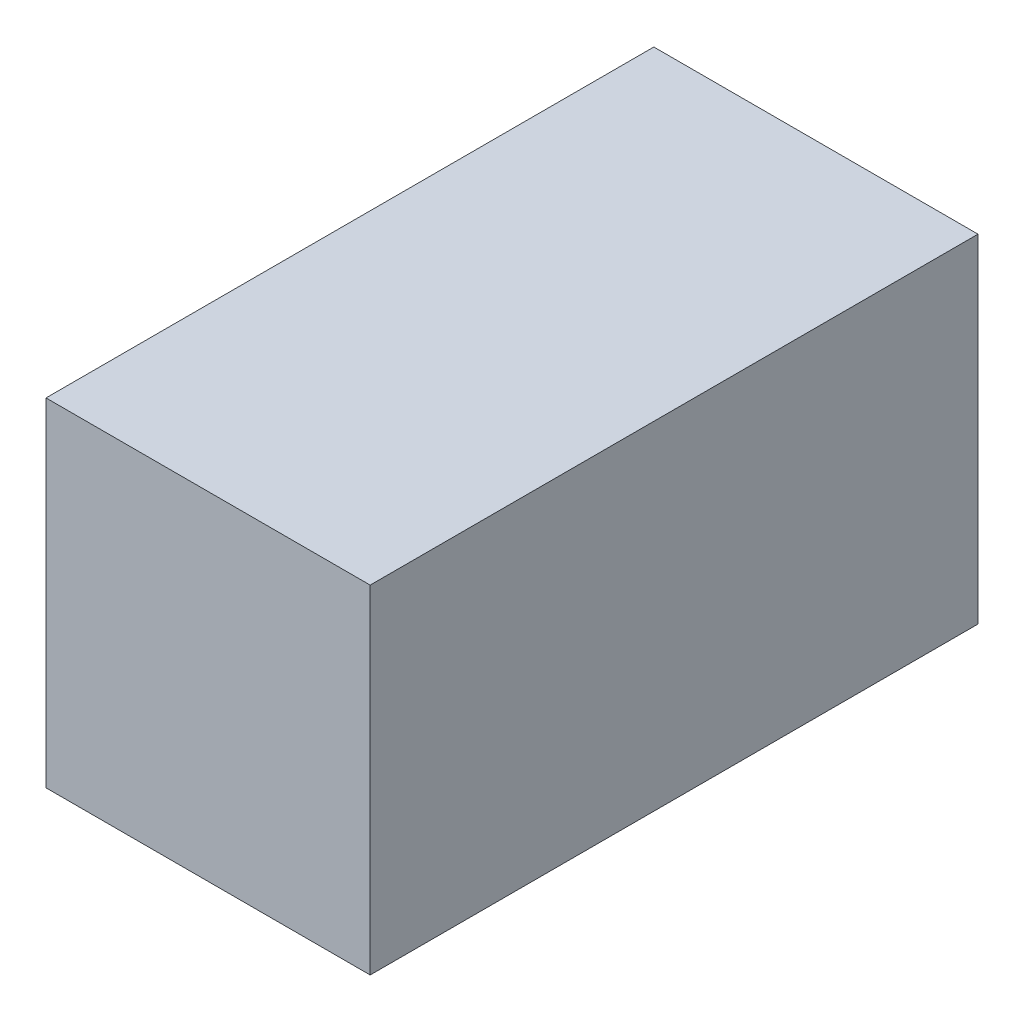
ISO-10303-21;
HEADER;
FILE_DESCRIPTION(('STEP AP214'),'2;1');
FILE_NAME('part.step','',(''),(''),'','','');
FILE_SCHEMA(('AUTOMOTIVE_DESIGN { 1 0 10303 214 1 1 1 1 }'));
ENDSEC;
DATA;
#1=APPLICATION_CONTEXT('core data for automotive mechanical design processes');
#2=APPLICATION_PROTOCOL_DEFINITION('international standard','automotive_design',2000,#1);
#3=PRODUCT_CONTEXT('',#1,'mechanical');
#4=PRODUCT('Part','Part','',(#3));
#5=PRODUCT_RELATED_PRODUCT_CATEGORY('part','',(#4));
#6=PRODUCT_DEFINITION_FORMATION('','',#4);
#7=PRODUCT_DEFINITION_CONTEXT('part definition',#1,'design');
#8=PRODUCT_DEFINITION('design','',#6,#7);
#9=PRODUCT_DEFINITION_SHAPE('','',#8);
#10=(LENGTH_UNIT() NAMED_UNIT(*) SI_UNIT(.MILLI.,.METRE.));
#11=(NAMED_UNIT(*) PLANE_ANGLE_UNIT() SI_UNIT($,.RADIAN.));
#12=(NAMED_UNIT(*) SI_UNIT($,.STERADIAN.) SOLID_ANGLE_UNIT());
#13=UNCERTAINTY_MEASURE_WITH_UNIT(LENGTH_MEASURE(1.E-05),#10,'distance_accuracy_value','');
#14=(GEOMETRIC_REPRESENTATION_CONTEXT(3) GLOBAL_UNCERTAINTY_ASSIGNED_CONTEXT((#13)) GLOBAL_UNIT_ASSIGNED_CONTEXT((#10,
#11,#12)) REPRESENTATION_CONTEXT('',''));
#15=CARTESIAN_POINT('',(0.,0.,0.));
#16=DIRECTION('',(0.,0.,1.));
#17=DIRECTION('',(1.,0.,0.));
#18=AXIS2_PLACEMENT_3D('',#15,#16,#17);
#19=CARTESIAN_POINT('',(30.48,20.6180258356904,25.0839366515837));
#20=DIRECTION('',(0.,0.,-1.));
#21=DIRECTION('',(0.,1.,0.));
#22=AXIS2_PLACEMENT_3D('',#19,#20,#21);
#23=PLANE('',#22);
#24=DIRECTION('',(0.,-1.,0.));
#25=VECTOR('',#24,1.);
#26=CARTESIAN_POINT('',(0.,20.6180258356904,25.0839366515837));
#27=LINE('',#26,#25);
#28=CARTESIAN_POINT('',(0.,20.6180258356904,25.0839366515837));
#29=VERTEX_POINT('',#28);
#30=CARTESIAN_POINT('',(0.,-11.1319741643096,25.0839366515837));
#31=VERTEX_POINT('',#30);
#32=EDGE_CURVE('E113',#29,#31,#27,.T.);
#33=ORIENTED_EDGE('',*,*,#32,.T.);
#34=DIRECTION('',(-1.,0.,0.));
#35=VECTOR('',#34,1.);
#36=CARTESIAN_POINT('',(30.48,-11.1319741643096,25.0839366515837));
#37=LINE('',#36,#35);
#38=CARTESIAN_POINT('',(30.48,-11.1319741643096,25.0839366515837));
#39=VERTEX_POINT('',#38);
#40=EDGE_CURVE('E11',#39,#31,#37,.T.);
#41=ORIENTED_EDGE('',*,*,#40,.F.);
#42=DIRECTION('',(0.,-1.,0.));
#43=VECTOR('',#42,1.);
#44=CARTESIAN_POINT('',(30.48,20.6180258356904,25.0839366515837));
#45=LINE('',#44,#43);
#46=CARTESIAN_POINT('',(30.48,20.6180258356904,25.0839366515837));
#47=VERTEX_POINT('',#46);
#48=EDGE_CURVE('E97',#47,#39,#45,.T.);
#49=ORIENTED_EDGE('',*,*,#48,.F.);
#50=DIRECTION('',(-1.,0.,0.));
#51=VECTOR('',#50,1.);
#52=CARTESIAN_POINT('',(30.48,20.6180258356904,25.0839366515837));
#53=LINE('',#52,#51);
#54=EDGE_CURVE('E109',#47,#29,#53,.T.);
#55=ORIENTED_EDGE('',*,*,#54,.T.);
#56=EDGE_LOOP('',(#33,#41,#49,#55));
#57=FACE_BOUND('',#56,.T.);
#58=ADVANCED_FACE('F45',(#57),#23,.F.);
#59=CARTESIAN_POINT('',(30.48,-11.1319741643096,25.0839366515837));
#60=DIRECTION('',(0.,1.,0.));
#61=DIRECTION('',(0.,0.,1.));
#62=AXIS2_PLACEMENT_3D('',#59,#60,#61);
#63=PLANE('',#62);
#64=DIRECTION('',(0.,0.,-1.));
#65=VECTOR('',#64,1.);
#66=CARTESIAN_POINT('',(0.,-11.1319741643096,25.0839366515837));
#67=LINE('',#66,#65);
#68=CARTESIAN_POINT('',(0.,-11.1319741643096,-32.0660633484163));
#69=VERTEX_POINT('',#68);
#70=EDGE_CURVE('E102',#31,#69,#67,.T.);
#71=ORIENTED_EDGE('',*,*,#70,.T.);
#72=DIRECTION('',(-1.,0.,0.));
#73=VECTOR('',#72,1.);
#74=CARTESIAN_POINT('',(30.48,-11.1319741643096,-32.0660633484163));
#75=LINE('',#74,#73);
#76=CARTESIAN_POINT('',(30.48,-11.1319741643096,-32.0660633484163));
#77=VERTEX_POINT('',#76);
#78=EDGE_CURVE('E54',#77,#69,#75,.T.);
#79=ORIENTED_EDGE('',*,*,#78,.F.);
#80=DIRECTION('',(0.,0.,-1.));
#81=VECTOR('',#80,1.);
#82=CARTESIAN_POINT('',(30.48,-11.1319741643096,25.0839366515837));
#83=LINE('',#82,#81);
#84=EDGE_CURVE('E92',#39,#77,#83,.T.);
#85=ORIENTED_EDGE('',*,*,#84,.F.);
#86=ORIENTED_EDGE('',*,*,#40,.T.);
#87=EDGE_LOOP('',(#71,#79,#85,#86));
#88=FACE_BOUND('',#87,.T.);
#89=ADVANCED_FACE('F101',(#88),#63,.F.);
#90=CARTESIAN_POINT('',(30.48,20.6180258356904,-32.0660633484163));
#91=DIRECTION('',(0.,0.,1.));
#92=DIRECTION('',(0.,-1.,0.));
#93=AXIS2_PLACEMENT_3D('',#90,#91,#92);
#94=PLANE('',#93);
#95=DIRECTION('',(0.,1.,0.));
#96=VECTOR('',#95,1.);
#97=CARTESIAN_POINT('',(0.,20.6180258356904,-32.0660633484163));
#98=LINE('',#97,#96);
#99=CARTESIAN_POINT('',(0.,20.6180258356904,-32.0660633484163));
#100=VERTEX_POINT('',#99);
#101=EDGE_CURVE('E79',#69,#100,#98,.T.);
#102=ORIENTED_EDGE('',*,*,#101,.T.);
#103=DIRECTION('',(-1.,0.,0.));
#104=VECTOR('',#103,1.);
#105=CARTESIAN_POINT('',(30.48,20.6180258356904,-32.0660633484163));
#106=LINE('',#105,#104);
#107=CARTESIAN_POINT('',(30.48,20.6180258356904,-32.0660633484163));
#108=VERTEX_POINT('',#107);
#109=EDGE_CURVE('E104',#108,#100,#106,.T.);
#110=ORIENTED_EDGE('',*,*,#109,.F.);
#111=DIRECTION('',(0.,1.,0.));
#112=VECTOR('',#111,1.);
#113=CARTESIAN_POINT('',(30.48,20.6180258356904,-32.0660633484163));
#114=LINE('',#113,#112);
#115=EDGE_CURVE('E95',#77,#108,#114,.T.);
#116=ORIENTED_EDGE('',*,*,#115,.F.);
#117=ORIENTED_EDGE('',*,*,#78,.T.);
#118=EDGE_LOOP('',(#102,#110,#116,#117));
#119=FACE_BOUND('',#118,.T.);
#120=ADVANCED_FACE('F105',(#119),#94,.F.);
#121=CARTESIAN_POINT('',(30.48,20.6180258356904,25.0839366515837));
#122=DIRECTION('',(0.,-1.,0.));
#123=DIRECTION('',(0.,0.,-1.));
#124=AXIS2_PLACEMENT_3D('',#121,#122,#123);
#125=PLANE('',#124);
#126=DIRECTION('',(0.,0.,1.));
#127=VECTOR('',#126,1.);
#128=CARTESIAN_POINT('',(0.,20.6180258356904,25.0839366515837));
#129=LINE('',#128,#127);
#130=EDGE_CURVE('E85',#100,#29,#129,.T.);
#131=ORIENTED_EDGE('',*,*,#130,.T.);
#132=ORIENTED_EDGE('',*,*,#54,.F.);
#133=DIRECTION('',(0.,0.,1.));
#134=VECTOR('',#133,1.);
#135=CARTESIAN_POINT('',(30.48,20.6180258356904,25.0839366515837));
#136=LINE('',#135,#134);
#137=EDGE_CURVE('E62',#108,#47,#136,.T.);
#138=ORIENTED_EDGE('',*,*,#137,.F.);
#139=ORIENTED_EDGE('',*,*,#109,.T.);
#140=EDGE_LOOP('',(#131,#132,#138,#139));
#141=FACE_BOUND('',#140,.T.);
#142=ADVANCED_FACE('F126',(#141),#125,.F.);
#143=CARTESIAN_POINT('',(30.48,0.,0.));
#144=DIRECTION('',(1.,0.,0.));
#145=DIRECTION('',(0.,0.,-1.));
#146=AXIS2_PLACEMENT_3D('',#143,#144,#145);
#147=PLANE('',#146);
#148=ORIENTED_EDGE('',*,*,#48,.T.);
#149=ORIENTED_EDGE('',*,*,#84,.T.);
#150=ORIENTED_EDGE('',*,*,#115,.T.);
#151=ORIENTED_EDGE('',*,*,#137,.T.);
#152=EDGE_LOOP('',(#148,#149,#150,#151));
#153=FACE_BOUND('',#152,.T.);
#154=ADVANCED_FACE('F93',(#153),#147,.T.);
#155=CARTESIAN_POINT('',(0.,0.,0.));
#156=DIRECTION('',(1.,0.,0.));
#157=DIRECTION('',(0.,0.,-1.));
#158=AXIS2_PLACEMENT_3D('',#155,#156,#157);
#159=PLANE('',#158);
#160=ORIENTED_EDGE('',*,*,#32,.F.);
#161=ORIENTED_EDGE('',*,*,#130,.F.);
#162=ORIENTED_EDGE('',*,*,#101,.F.);
#163=ORIENTED_EDGE('',*,*,#70,.F.);
#164=EDGE_LOOP('',(#160,#161,#162,#163));
#165=FACE_BOUND('',#164,.T.);
#166=ADVANCED_FACE('F129',(#165),#159,.F.);
#167=CLOSED_SHELL('',(#58,#89,#120,#142,#154,#166));
#168=MANIFOLD_SOLID_BREP('B2',#167);
#169=ADVANCED_BREP_SHAPE_REPRESENTATION('',(#18,#168),#14);
#170=SHAPE_DEFINITION_REPRESENTATION(#9,#169);
ENDSEC;
END-ISO-10303-21;
